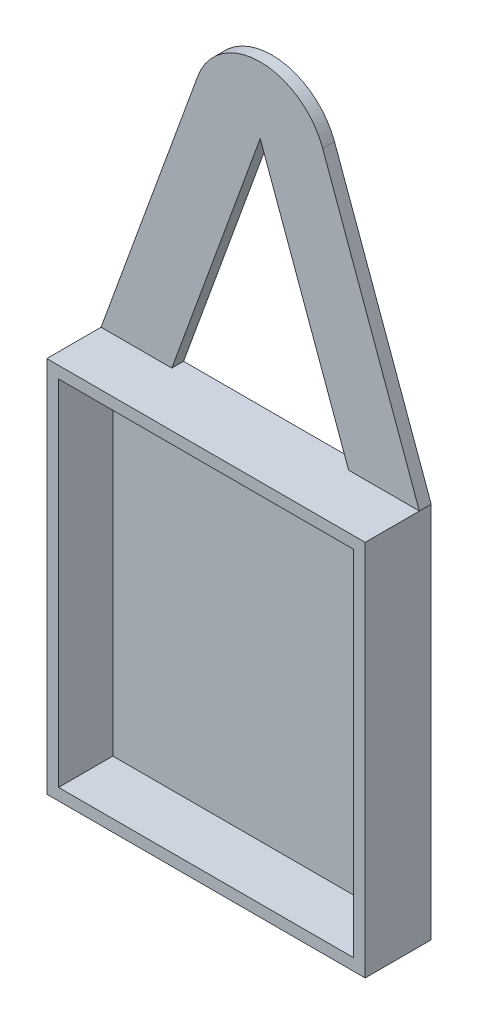
ISO-10303-21;
HEADER;
FILE_DESCRIPTION(('STEP AP214'),'2;1');
FILE_NAME('part.step','',(''),(''),'','','');
FILE_SCHEMA(('AUTOMOTIVE_DESIGN { 1 0 10303 214 1 1 1 1 }'));
ENDSEC;
DATA;
#1=APPLICATION_CONTEXT('core data for automotive mechanical design processes');
#2=APPLICATION_PROTOCOL_DEFINITION('international standard','automotive_design',2000,#1);
#3=PRODUCT_CONTEXT('',#1,'mechanical');
#4=PRODUCT('Part','Part','',(#3));
#5=PRODUCT_RELATED_PRODUCT_CATEGORY('part','',(#4));
#6=PRODUCT_DEFINITION_FORMATION('','',#4);
#7=PRODUCT_DEFINITION_CONTEXT('part definition',#1,'design');
#8=PRODUCT_DEFINITION('design','',#6,#7);
#9=PRODUCT_DEFINITION_SHAPE('','',#8);
#10=(LENGTH_UNIT() NAMED_UNIT(*) SI_UNIT(.MILLI.,.METRE.));
#11=(NAMED_UNIT(*) PLANE_ANGLE_UNIT() SI_UNIT($,.RADIAN.));
#12=(NAMED_UNIT(*) SI_UNIT($,.STERADIAN.) SOLID_ANGLE_UNIT());
#13=UNCERTAINTY_MEASURE_WITH_UNIT(LENGTH_MEASURE(1.E-05),#10,'distance_accuracy_value','');
#14=(GEOMETRIC_REPRESENTATION_CONTEXT(3) GLOBAL_UNCERTAINTY_ASSIGNED_CONTEXT((#13)) GLOBAL_UNIT_ASSIGNED_CONTEXT((#10,
#11,#12)) REPRESENTATION_CONTEXT('',''));
#15=CARTESIAN_POINT('',(0.,0.,0.));
#16=DIRECTION('',(0.,0.,1.));
#17=DIRECTION('',(1.,0.,0.));
#18=AXIS2_PLACEMENT_3D('',#15,#16,#17);
#19=CARTESIAN_POINT('',(0.,183.030403229549,5.));
#20=DIRECTION('',(0.,0.,-1.));
#21=DIRECTION('',(-1.,0.,0.));
#22=AXIS2_PLACEMENT_3D('',#19,#20,#21);
#23=PLANE('',#22);
#24=DIRECTION('',(-1.,0.,0.));
#25=VECTOR('',#24,1.);
#26=CARTESIAN_POINT('',(-67.5000000000001,80.,5.));
#27=LINE('',#26,#25);
#28=CARTESIAN_POINT('',(67.4999999999999,79.9999999999998,5.));
#29=VERTEX_POINT('',#28);
#30=CARTESIAN_POINT('',(37.5,80.,5.));
#31=VERTEX_POINT('',#30);
#32=EDGE_CURVE('E49',#29,#31,#27,.T.);
#33=ORIENTED_EDGE('',*,*,#32,.F.);
#34=DIRECTION('',(-0.342020143325665,0.93969262078591,0.));
#35=VECTOR('',#34,1.);
#36=CARTESIAN_POINT('',(26.4906666467847,192.672217374847,5.));
#37=LINE('',#36,#35);
#38=CARTESIAN_POINT('',(26.4906666467847,192.672217374847,5.));
#39=VERTEX_POINT('',#38);
#40=EDGE_CURVE('E221',#29,#39,#37,.T.);
#41=ORIENTED_EDGE('',*,*,#40,.T.);
#42=CARTESIAN_POINT('',(0.,183.030403229549,5.));
#43=DIRECTION('',(0.,0.,1.));
#44=DIRECTION('',(-1.,0.,0.));
#45=AXIS2_PLACEMENT_3D('',#42,#43,#44);
#46=CIRCLE('',#45,28.1907786235773);
#47=CARTESIAN_POINT('',(-26.4906666467847,192.672217374847,5.));
#48=VERTEX_POINT('',#47);
#49=EDGE_CURVE('E223',#39,#48,#46,.T.);
#50=ORIENTED_EDGE('',*,*,#49,.T.);
#51=DIRECTION('',(-0.342020143325667,-0.939692620785909,0.));
#52=VECTOR('',#51,1.);
#53=CARTESIAN_POINT('',(-67.5000000000001,80.0000000000001,5.));
#54=LINE('',#53,#52);
#55=CARTESIAN_POINT('',(-67.5000000000001,80.,5.));
#56=VERTEX_POINT('',#55);
#57=EDGE_CURVE('E226',#48,#56,#54,.T.);
#58=ORIENTED_EDGE('',*,*,#57,.T.);
#59=CARTESIAN_POINT('',(-37.5,80.,5.));
#60=VERTEX_POINT('',#59);
#61=EDGE_CURVE('E11',#60,#56,#27,.T.);
#62=ORIENTED_EDGE('',*,*,#61,.F.);
#63=DIRECTION('',(-0.342020143325666,-0.939692620785909,0.));
#64=VECTOR('',#63,1.);
#65=CARTESIAN_POINT('',(-37.5,80.,5.));
#66=LINE('',#65,#64);
#67=CARTESIAN_POINT('',(0.,183.030403229549,5.));
#68=VERTEX_POINT('',#67);
#69=EDGE_CURVE('E200',#68,#60,#66,.T.);
#70=ORIENTED_EDGE('',*,*,#69,.F.);
#71=DIRECTION('',(-0.342020143325666,0.939692620785909,0.));
#72=VECTOR('',#71,1.);
#73=CARTESIAN_POINT('',(0.,183.030403229549,5.));
#74=LINE('',#73,#72);
#75=EDGE_CURVE('E203',#31,#68,#74,.T.);
#76=ORIENTED_EDGE('',*,*,#75,.F.);
#77=EDGE_LOOP('',(#33,#41,#50,#58,#62,#70,#76));
#78=FACE_BOUND('',#77,.T.);
#79=ADVANCED_FACE('F39',(#78),#23,.F.);
#80=CARTESIAN_POINT('',(0.,183.030403229549,0.));
#81=DIRECTION('',(0.,0.,-1.));
#82=DIRECTION('',(-1.,0.,0.));
#83=AXIS2_PLACEMENT_3D('',#80,#81,#82);
#84=PLANE('',#83);
#85=DIRECTION('',(0.,1.,0.));
#86=VECTOR('',#85,1.);
#87=CARTESIAN_POINT('',(67.4999999999999,79.9999999999998,0.));
#88=LINE('',#87,#86);
#89=CARTESIAN_POINT('',(67.4999999999999,-79.9999999999999,0.));
#90=VERTEX_POINT('',#89);
#91=CARTESIAN_POINT('',(67.4999999999999,79.9999999999998,0.));
#92=VERTEX_POINT('',#91);
#93=EDGE_CURVE('E220',#90,#92,#88,.T.);
#94=ORIENTED_EDGE('',*,*,#93,.F.);
#95=DIRECTION('',(1.,0.,0.));
#96=VECTOR('',#95,1.);
#97=CARTESIAN_POINT('',(-67.5000000000001,-79.9999999999999,0.));
#98=LINE('',#97,#96);
#99=CARTESIAN_POINT('',(-67.5000000000001,-79.9999999999999,0.));
#100=VERTEX_POINT('',#99);
#101=EDGE_CURVE('E224',#100,#90,#98,.T.);
#102=ORIENTED_EDGE('',*,*,#101,.F.);
#103=DIRECTION('',(0.,-1.,0.));
#104=VECTOR('',#103,1.);
#105=CARTESIAN_POINT('',(-67.5000000000001,80.0000000000001,0.));
#106=LINE('',#105,#104);
#107=CARTESIAN_POINT('',(-67.5000000000001,80.0000000000001,0.));
#108=VERTEX_POINT('',#107);
#109=EDGE_CURVE('E238',#108,#100,#106,.T.);
#110=ORIENTED_EDGE('',*,*,#109,.F.);
#111=DIRECTION('',(-0.342020143325667,-0.939692620785909,0.));
#112=VECTOR('',#111,1.);
#113=CARTESIAN_POINT('',(-67.5000000000001,80.0000000000001,0.));
#114=LINE('',#113,#112);
#115=CARTESIAN_POINT('',(-26.4906666467847,192.672217374847,0.));
#116=VERTEX_POINT('',#115);
#117=EDGE_CURVE('E236',#116,#108,#114,.T.);
#118=ORIENTED_EDGE('',*,*,#117,.F.);
#119=CARTESIAN_POINT('',(0.,183.030403229549,0.));
#120=DIRECTION('',(0.,0.,1.));
#121=DIRECTION('',(-1.,0.,0.));
#122=AXIS2_PLACEMENT_3D('',#119,#120,#121);
#123=CIRCLE('',#122,28.1907786235773);
#124=CARTESIAN_POINT('',(26.4906666467847,192.672217374847,0.));
#125=VERTEX_POINT('',#124);
#126=EDGE_CURVE('E234',#125,#116,#123,.T.);
#127=ORIENTED_EDGE('',*,*,#126,.F.);
#128=DIRECTION('',(-0.342020143325665,0.93969262078591,0.));
#129=VECTOR('',#128,1.);
#130=CARTESIAN_POINT('',(26.4906666467847,192.672217374847,0.));
#131=LINE('',#130,#129);
#132=EDGE_CURVE('E232',#92,#125,#131,.T.);
#133=ORIENTED_EDGE('',*,*,#132,.F.);
#134=EDGE_LOOP('',(#94,#102,#110,#118,#127,#133));
#135=FACE_BOUND('',#134,.T.);
#136=DIRECTION('',(-0.342020143325666,0.939692620785909,0.));
#137=VECTOR('',#136,1.);
#138=CARTESIAN_POINT('',(0.,183.030403229549,0.));
#139=LINE('',#138,#137);
#140=CARTESIAN_POINT('',(37.5,80.,0.));
#141=VERTEX_POINT('',#140);
#142=CARTESIAN_POINT('',(0.,183.030403229549,0.));
#143=VERTEX_POINT('',#142);
#144=EDGE_CURVE('E204',#141,#143,#139,.T.);
#145=ORIENTED_EDGE('',*,*,#144,.T.);
#146=DIRECTION('',(-0.342020143325666,-0.939692620785909,0.));
#147=VECTOR('',#146,1.);
#148=CARTESIAN_POINT('',(-37.5,80.,0.));
#149=LINE('',#148,#147);
#150=CARTESIAN_POINT('',(-37.5,80.,0.));
#151=VERTEX_POINT('',#150);
#152=EDGE_CURVE('E199',#143,#151,#149,.T.);
#153=ORIENTED_EDGE('',*,*,#152,.T.);
#154=DIRECTION('',(1.,0.,0.));
#155=VECTOR('',#154,1.);
#156=CARTESIAN_POINT('',(-37.5,80.,0.));
#157=LINE('',#156,#155);
#158=EDGE_CURVE('E209',#151,#141,#157,.T.);
#159=ORIENTED_EDGE('',*,*,#158,.T.);
#160=EDGE_LOOP('',(#145,#153,#159));
#161=FACE_BOUND('',#160,.T.);
#162=ADVANCED_FACE('F268',(#135,#161),#84,.T.);
#163=CARTESIAN_POINT('',(67.4999999999999,79.9999999999998,5.));
#164=DIRECTION('',(-1.,0.,0.));
#165=DIRECTION('',(0.,0.,1.));
#166=AXIS2_PLACEMENT_3D('',#163,#164,#165);
#167=PLANE('',#166);
#168=ORIENTED_EDGE('',*,*,#93,.T.);
#169=DIRECTION('',(0.,0.,-1.));
#170=VECTOR('',#169,1.);
#171=CARTESIAN_POINT('',(67.4999999999999,79.9999999999998,5.));
#172=LINE('',#171,#170);
#173=EDGE_CURVE('E43',#29,#92,#172,.T.);
#174=ORIENTED_EDGE('',*,*,#173,.F.);
#175=DIRECTION('',(0.,0.,-1.));
#176=VECTOR('',#175,1.);
#177=CARTESIAN_POINT('',(67.4999999999999,80.,28.));
#178=LINE('',#177,#176);
#179=CARTESIAN_POINT('',(67.4999999999999,80.,28.));
#180=VERTEX_POINT('',#179);
#181=EDGE_CURVE('E196',#180,#29,#178,.T.);
#182=ORIENTED_EDGE('',*,*,#181,.F.);
#183=DIRECTION('',(0.,1.,0.));
#184=VECTOR('',#183,1.);
#185=CARTESIAN_POINT('',(67.4999999999999,80.,28.));
#186=LINE('',#185,#184);
#187=CARTESIAN_POINT('',(67.4999999999999,-80.,28.));
#188=VERTEX_POINT('',#187);
#189=EDGE_CURVE('E188',#188,#180,#186,.T.);
#190=ORIENTED_EDGE('',*,*,#189,.F.);
#191=DIRECTION('',(0.,0.,-1.));
#192=VECTOR('',#191,1.);
#193=CARTESIAN_POINT('',(67.4999999999999,-79.9999999999999,5.));
#194=LINE('',#193,#192);
#195=EDGE_CURVE('E229',#188,#90,#194,.T.);
#196=ORIENTED_EDGE('',*,*,#195,.T.);
#197=EDGE_LOOP('',(#168,#174,#182,#190,#196));
#198=FACE_BOUND('',#197,.T.);
#199=ADVANCED_FACE('F41',(#198),#167,.F.);
#200=CARTESIAN_POINT('',(26.4906666467847,192.672217374847,5.));
#201=DIRECTION('',(-0.93969262078591,-0.342020143325665,0.));
#202=DIRECTION('',(0.342020143325665,-0.93969262078591,0.));
#203=AXIS2_PLACEMENT_3D('',#200,#201,#202);
#204=PLANE('',#203);
#205=ORIENTED_EDGE('',*,*,#132,.T.);
#206=DIRECTION('',(0.,0.,-1.));
#207=VECTOR('',#206,1.);
#208=CARTESIAN_POINT('',(26.4906666467847,192.672217374847,5.));
#209=LINE('',#208,#207);
#210=EDGE_CURVE('E251',#39,#125,#209,.T.);
#211=ORIENTED_EDGE('',*,*,#210,.F.);
#212=ORIENTED_EDGE('',*,*,#40,.F.);
#213=ORIENTED_EDGE('',*,*,#173,.T.);
#214=EDGE_LOOP('',(#205,#211,#212,#213));
#215=FACE_BOUND('',#214,.T.);
#216=ADVANCED_FACE('F261',(#215),#204,.F.);
#217=CARTESIAN_POINT('',(0.,183.030403229549,5.));
#218=DIRECTION('',(0.,0.,-1.));
#219=DIRECTION('',(-1.,0.,0.));
#220=AXIS2_PLACEMENT_3D('',#217,#218,#219);
#221=CYLINDRICAL_SURFACE('',#220,28.1907786235773);
#222=ORIENTED_EDGE('',*,*,#126,.T.);
#223=DIRECTION('',(0.,0.,-1.));
#224=VECTOR('',#223,1.);
#225=CARTESIAN_POINT('',(-26.4906666467847,192.672217374847,5.));
#226=LINE('',#225,#224);
#227=EDGE_CURVE('E249',#48,#116,#226,.T.);
#228=ORIENTED_EDGE('',*,*,#227,.F.);
#229=ORIENTED_EDGE('',*,*,#49,.F.);
#230=ORIENTED_EDGE('',*,*,#210,.T.);
#231=EDGE_LOOP('',(#222,#228,#229,#230));
#232=FACE_BOUND('',#231,.T.);
#233=ADVANCED_FACE('F273',(#232),#221,.T.);
#234=CARTESIAN_POINT('',(-67.5000000000001,80.0000000000001,5.));
#235=DIRECTION('',(0.939692620785909,-0.342020143325667,0.));
#236=DIRECTION('',(0.342020143325667,0.939692620785909,0.));
#237=AXIS2_PLACEMENT_3D('',#234,#235,#236);
#238=PLANE('',#237);
#239=ORIENTED_EDGE('',*,*,#117,.T.);
#240=DIRECTION('',(0.,0.,-1.));
#241=VECTOR('',#240,1.);
#242=CARTESIAN_POINT('',(-67.5000000000001,80.0000000000001,5.));
#243=LINE('',#242,#241);
#244=EDGE_CURVE('E246',#56,#108,#243,.T.);
#245=ORIENTED_EDGE('',*,*,#244,.F.);
#246=ORIENTED_EDGE('',*,*,#57,.F.);
#247=ORIENTED_EDGE('',*,*,#227,.T.);
#248=EDGE_LOOP('',(#239,#245,#246,#247));
#249=FACE_BOUND('',#248,.T.);
#250=ADVANCED_FACE('F276',(#249),#238,.F.);
#251=CARTESIAN_POINT('',(-67.5000000000001,80.0000000000001,5.));
#252=DIRECTION('',(1.,0.,0.));
#253=DIRECTION('',(0.,0.,-1.));
#254=AXIS2_PLACEMENT_3D('',#251,#252,#253);
#255=PLANE('',#254);
#256=ORIENTED_EDGE('',*,*,#109,.T.);
#257=DIRECTION('',(0.,0.,-1.));
#258=VECTOR('',#257,1.);
#259=CARTESIAN_POINT('',(-67.5000000000001,-79.9999999999999,5.));
#260=LINE('',#259,#258);
#261=CARTESIAN_POINT('',(-67.5000000000001,-80.,28.));
#262=VERTEX_POINT('',#261);
#263=EDGE_CURVE('E243',#262,#100,#260,.T.);
#264=ORIENTED_EDGE('',*,*,#263,.F.);
#265=DIRECTION('',(0.,-1.,0.));
#266=VECTOR('',#265,1.);
#267=CARTESIAN_POINT('',(-67.5000000000001,-80.,28.));
#268=LINE('',#267,#266);
#269=CARTESIAN_POINT('',(-67.5000000000001,80.,28.));
#270=VERTEX_POINT('',#269);
#271=EDGE_CURVE('E182',#270,#262,#268,.T.);
#272=ORIENTED_EDGE('',*,*,#271,.F.);
#273=DIRECTION('',(0.,0.,-1.));
#274=VECTOR('',#273,1.);
#275=CARTESIAN_POINT('',(-67.5000000000001,80.,28.));
#276=LINE('',#275,#274);
#277=EDGE_CURVE('E191',#270,#56,#276,.T.);
#278=ORIENTED_EDGE('',*,*,#277,.T.);
#279=ORIENTED_EDGE('',*,*,#244,.T.);
#280=EDGE_LOOP('',(#256,#264,#272,#278,#279));
#281=FACE_BOUND('',#280,.T.);
#282=ADVANCED_FACE('F286',(#281),#255,.F.);
#283=CARTESIAN_POINT('',(-67.5000000000001,-79.9999999999999,5.));
#284=DIRECTION('',(0.,1.,0.));
#285=DIRECTION('',(0.,0.,1.));
#286=AXIS2_PLACEMENT_3D('',#283,#284,#285);
#287=PLANE('',#286);
#288=ORIENTED_EDGE('',*,*,#101,.T.);
#289=ORIENTED_EDGE('',*,*,#195,.F.);
#290=DIRECTION('',(1.,0.,0.));
#291=VECTOR('',#290,1.);
#292=CARTESIAN_POINT('',(67.4999999999999,-80.,28.));
#293=LINE('',#292,#291);
#294=EDGE_CURVE('E185',#262,#188,#293,.T.);
#295=ORIENTED_EDGE('',*,*,#294,.F.);
#296=ORIENTED_EDGE('',*,*,#263,.T.);
#297=EDGE_LOOP('',(#288,#289,#295,#296));
#298=FACE_BOUND('',#297,.T.);
#299=ADVANCED_FACE('F304',(#298),#287,.F.);
#300=CARTESIAN_POINT('',(-37.5,80.,5.));
#301=DIRECTION('',(0.939692620785909,-0.342020143325666,0.));
#302=DIRECTION('',(0.342020143325666,0.939692620785909,0.));
#303=AXIS2_PLACEMENT_3D('',#300,#301,#302);
#304=PLANE('',#303);
#305=ORIENTED_EDGE('',*,*,#152,.F.);
#306=DIRECTION('',(0.,0.,-1.));
#307=VECTOR('',#306,1.);
#308=CARTESIAN_POINT('',(0.,183.030403229549,5.));
#309=LINE('',#308,#307);
#310=EDGE_CURVE('E206',#68,#143,#309,.T.);
#311=ORIENTED_EDGE('',*,*,#310,.F.);
#312=ORIENTED_EDGE('',*,*,#69,.T.);
#313=DIRECTION('',(0.,0.,-1.));
#314=VECTOR('',#313,1.);
#315=CARTESIAN_POINT('',(-37.5,80.,5.));
#316=LINE('',#315,#314);
#317=EDGE_CURVE('E217',#60,#151,#316,.T.);
#318=ORIENTED_EDGE('',*,*,#317,.T.);
#319=EDGE_LOOP('',(#305,#311,#312,#318));
#320=FACE_BOUND('',#319,.T.);
#321=ADVANCED_FACE('F292',(#320),#304,.T.);
#322=CARTESIAN_POINT('',(-37.5,80.,5.));
#323=DIRECTION('',(0.,1.,0.));
#324=DIRECTION('',(0.,0.,1.));
#325=AXIS2_PLACEMENT_3D('',#322,#323,#324);
#326=PLANE('',#325);
#327=ORIENTED_EDGE('',*,*,#158,.F.);
#328=ORIENTED_EDGE('',*,*,#317,.F.);
#329=ORIENTED_EDGE('',*,*,#61,.T.);
#330=ORIENTED_EDGE('',*,*,#277,.F.);
#331=DIRECTION('',(-1.,0.,0.));
#332=VECTOR('',#331,1.);
#333=CARTESIAN_POINT('',(-67.5000000000001,80.,28.));
#334=LINE('',#333,#332);
#335=EDGE_CURVE('E190',#180,#270,#334,.T.);
#336=ORIENTED_EDGE('',*,*,#335,.F.);
#337=ORIENTED_EDGE('',*,*,#181,.T.);
#338=ORIENTED_EDGE('',*,*,#32,.T.);
#339=DIRECTION('',(0.,0.,-1.));
#340=VECTOR('',#339,1.);
#341=CARTESIAN_POINT('',(37.5,80.,5.));
#342=LINE('',#341,#340);
#343=EDGE_CURVE('E64',#31,#141,#342,.T.);
#344=ORIENTED_EDGE('',*,*,#343,.T.);
#345=EDGE_LOOP('',(#327,#328,#329,#330,#336,#337,#338,#344));
#346=FACE_BOUND('',#345,.T.);
#347=ADVANCED_FACE('F282',(#346),#326,.T.);
#348=CARTESIAN_POINT('',(0.,183.030403229549,5.));
#349=DIRECTION('',(-0.939692620785909,-0.342020143325666,0.));
#350=DIRECTION('',(0.342020143325666,-0.939692620785909,0.));
#351=AXIS2_PLACEMENT_3D('',#348,#349,#350);
#352=PLANE('',#351);
#353=ORIENTED_EDGE('',*,*,#144,.F.);
#354=ORIENTED_EDGE('',*,*,#343,.F.);
#355=ORIENTED_EDGE('',*,*,#75,.T.);
#356=ORIENTED_EDGE('',*,*,#310,.T.);
#357=EDGE_LOOP('',(#353,#354,#355,#356));
#358=FACE_BOUND('',#357,.T.);
#359=ADVANCED_FACE('F290',(#358),#352,.T.);
#360=CARTESIAN_POINT('',(0.,0.,28.));
#361=DIRECTION('',(0.,0.,-1.));
#362=DIRECTION('',(-1.,0.,0.));
#363=AXIS2_PLACEMENT_3D('',#360,#361,#362);
#364=PLANE('',#363);
#365=ORIENTED_EDGE('',*,*,#271,.T.);
#366=ORIENTED_EDGE('',*,*,#294,.T.);
#367=ORIENTED_EDGE('',*,*,#189,.T.);
#368=ORIENTED_EDGE('',*,*,#335,.T.);
#369=EDGE_LOOP('',(#365,#366,#367,#368));
#370=FACE_BOUND('',#369,.T.);
#371=DIRECTION('',(0.,1.,0.));
#372=VECTOR('',#371,1.);
#373=CARTESIAN_POINT('',(62.4999999999999,75.,28.));
#374=LINE('',#373,#372);
#375=CARTESIAN_POINT('',(62.4999999999999,-75.0000000000002,28.));
#376=VERTEX_POINT('',#375);
#377=CARTESIAN_POINT('',(62.4999999999999,75.,28.));
#378=VERTEX_POINT('',#377);
#379=EDGE_CURVE('E144',#376,#378,#374,.T.);
#380=ORIENTED_EDGE('',*,*,#379,.F.);
#381=DIRECTION('',(1.,0.,0.));
#382=VECTOR('',#381,1.);
#383=CARTESIAN_POINT('',(-62.4999999999999,-75.0000000000002,28.));
#384=LINE('',#383,#382);
#385=CARTESIAN_POINT('',(-62.4999999999999,-75.0000000000002,28.));
#386=VERTEX_POINT('',#385);
#387=EDGE_CURVE('E167',#386,#376,#384,.T.);
#388=ORIENTED_EDGE('',*,*,#387,.F.);
#389=DIRECTION('',(0.,-1.,0.));
#390=VECTOR('',#389,1.);
#391=CARTESIAN_POINT('',(-62.4999999999999,75.,28.));
#392=LINE('',#391,#390);
#393=CARTESIAN_POINT('',(-62.4999999999999,75.,28.));
#394=VERTEX_POINT('',#393);
#395=EDGE_CURVE('E165',#394,#386,#392,.T.);
#396=ORIENTED_EDGE('',*,*,#395,.F.);
#397=DIRECTION('',(-1.,0.,0.));
#398=VECTOR('',#397,1.);
#399=CARTESIAN_POINT('',(-62.4999999999999,75.,28.));
#400=LINE('',#399,#398);
#401=EDGE_CURVE('E153',#378,#394,#400,.T.);
#402=ORIENTED_EDGE('',*,*,#401,.F.);
#403=EDGE_LOOP('',(#380,#388,#396,#402));
#404=FACE_BOUND('',#403,.T.);
#405=ADVANCED_FACE('F163',(#370,#404),#364,.F.);
#406=CARTESIAN_POINT('',(62.4999999999999,75.,28.));
#407=DIRECTION('',(-1.,0.,0.));
#408=DIRECTION('',(0.,-1.,0.));
#409=AXIS2_PLACEMENT_3D('',#406,#407,#408);
#410=PLANE('',#409);
#411=DIRECTION('',(0.,1.,0.));
#412=VECTOR('',#411,1.);
#413=CARTESIAN_POINT('',(62.4999999999999,75.,5.));
#414=LINE('',#413,#412);
#415=CARTESIAN_POINT('',(62.4999999999999,-75.0000000000002,5.));
#416=VERTEX_POINT('',#415);
#417=CARTESIAN_POINT('',(62.4999999999999,75.,5.));
#418=VERTEX_POINT('',#417);
#419=EDGE_CURVE('E171',#416,#418,#414,.T.);
#420=ORIENTED_EDGE('',*,*,#419,.F.);
#421=DIRECTION('',(0.,0.,-1.));
#422=VECTOR('',#421,1.);
#423=CARTESIAN_POINT('',(62.4999999999999,-75.0000000000002,28.));
#424=LINE('',#423,#422);
#425=EDGE_CURVE('E149',#376,#416,#424,.T.);
#426=ORIENTED_EDGE('',*,*,#425,.F.);
#427=ORIENTED_EDGE('',*,*,#379,.T.);
#428=DIRECTION('',(0.,0.,-1.));
#429=VECTOR('',#428,1.);
#430=CARTESIAN_POINT('',(62.4999999999999,75.,28.));
#431=LINE('',#430,#429);
#432=EDGE_CURVE('E147',#378,#418,#431,.T.);
#433=ORIENTED_EDGE('',*,*,#432,.T.);
#434=EDGE_LOOP('',(#420,#426,#427,#433));
#435=FACE_BOUND('',#434,.T.);
#436=ADVANCED_FACE('F146',(#435),#410,.T.);
#437=CARTESIAN_POINT('',(-62.4999999999999,75.,28.));
#438=DIRECTION('',(0.,-1.,0.));
#439=DIRECTION('',(0.,0.,-1.));
#440=AXIS2_PLACEMENT_3D('',#437,#438,#439);
#441=PLANE('',#440);
#442=DIRECTION('',(-1.,0.,0.));
#443=VECTOR('',#442,1.);
#444=CARTESIAN_POINT('',(-62.4999999999999,75.,5.));
#445=LINE('',#444,#443);
#446=CARTESIAN_POINT('',(-62.4999999999999,75.,5.));
#447=VERTEX_POINT('',#446);
#448=EDGE_CURVE('E159',#418,#447,#445,.T.);
#449=ORIENTED_EDGE('',*,*,#448,.F.);
#450=ORIENTED_EDGE('',*,*,#432,.F.);
#451=ORIENTED_EDGE('',*,*,#401,.T.);
#452=DIRECTION('',(0.,0.,-1.));
#453=VECTOR('',#452,1.);
#454=CARTESIAN_POINT('',(-62.4999999999999,75.,28.));
#455=LINE('',#454,#453);
#456=EDGE_CURVE('E160',#394,#447,#455,.T.);
#457=ORIENTED_EDGE('',*,*,#456,.T.);
#458=EDGE_LOOP('',(#449,#450,#451,#457));
#459=FACE_BOUND('',#458,.T.);
#460=ADVANCED_FACE('F156',(#459),#441,.T.);
#461=CARTESIAN_POINT('',(-62.4999999999999,75.,28.));
#462=DIRECTION('',(1.,0.,0.));
#463=DIRECTION('',(0.,1.,0.));
#464=AXIS2_PLACEMENT_3D('',#461,#462,#463);
#465=PLANE('',#464);
#466=DIRECTION('',(0.,-1.,0.));
#467=VECTOR('',#466,1.);
#468=CARTESIAN_POINT('',(-62.4999999999999,75.,5.));
#469=LINE('',#468,#467);
#470=CARTESIAN_POINT('',(-62.4999999999999,-75.0000000000002,5.));
#471=VERTEX_POINT('',#470);
#472=EDGE_CURVE('E174',#447,#471,#469,.T.);
#473=ORIENTED_EDGE('',*,*,#472,.F.);
#474=ORIENTED_EDGE('',*,*,#456,.F.);
#475=ORIENTED_EDGE('',*,*,#395,.T.);
#476=DIRECTION('',(0.,0.,-1.));
#477=VECTOR('',#476,1.);
#478=CARTESIAN_POINT('',(-62.4999999999999,-75.0000000000002,28.));
#479=LINE('',#478,#477);
#480=EDGE_CURVE('E179',#386,#471,#479,.T.);
#481=ORIENTED_EDGE('',*,*,#480,.T.);
#482=EDGE_LOOP('',(#473,#474,#475,#481));
#483=FACE_BOUND('',#482,.T.);
#484=ADVANCED_FACE('F371',(#483),#465,.T.);
#485=CARTESIAN_POINT('',(-62.4999999999999,-75.0000000000002,28.));
#486=DIRECTION('',(0.,1.,0.));
#487=DIRECTION('',(0.,0.,1.));
#488=AXIS2_PLACEMENT_3D('',#485,#486,#487);
#489=PLANE('',#488);
#490=DIRECTION('',(1.,0.,0.));
#491=VECTOR('',#490,1.);
#492=CARTESIAN_POINT('',(-62.4999999999999,-75.0000000000002,5.));
#493=LINE('',#492,#491);
#494=EDGE_CURVE('E56',#471,#416,#493,.T.);
#495=ORIENTED_EDGE('',*,*,#494,.F.);
#496=ORIENTED_EDGE('',*,*,#480,.F.);
#497=ORIENTED_EDGE('',*,*,#387,.T.);
#498=ORIENTED_EDGE('',*,*,#425,.T.);
#499=EDGE_LOOP('',(#495,#496,#497,#498));
#500=FACE_BOUND('',#499,.T.);
#501=ADVANCED_FACE('F379',(#500),#489,.T.);
#502=ORIENTED_EDGE('',*,*,#472,.T.);
#503=ORIENTED_EDGE('',*,*,#494,.T.);
#504=ORIENTED_EDGE('',*,*,#419,.T.);
#505=ORIENTED_EDGE('',*,*,#448,.T.);
#506=EDGE_LOOP('',(#502,#503,#504,#505));
#507=FACE_BOUND('',#506,.T.);
#508=ADVANCED_FACE('F301',(#507),#23,.F.);
#509=CLOSED_SHELL('',(#79,#162,#199,#216,#233,#250,#282,#299,#321,#347,#359,#405,#436,#460,#484,
#501,#508));
#510=MANIFOLD_SOLID_BREP('B2',#509);
#511=ADVANCED_BREP_SHAPE_REPRESENTATION('',(#18,#510),#14);
#512=SHAPE_DEFINITION_REPRESENTATION(#9,#511);
ENDSEC;
END-ISO-10303-21;
